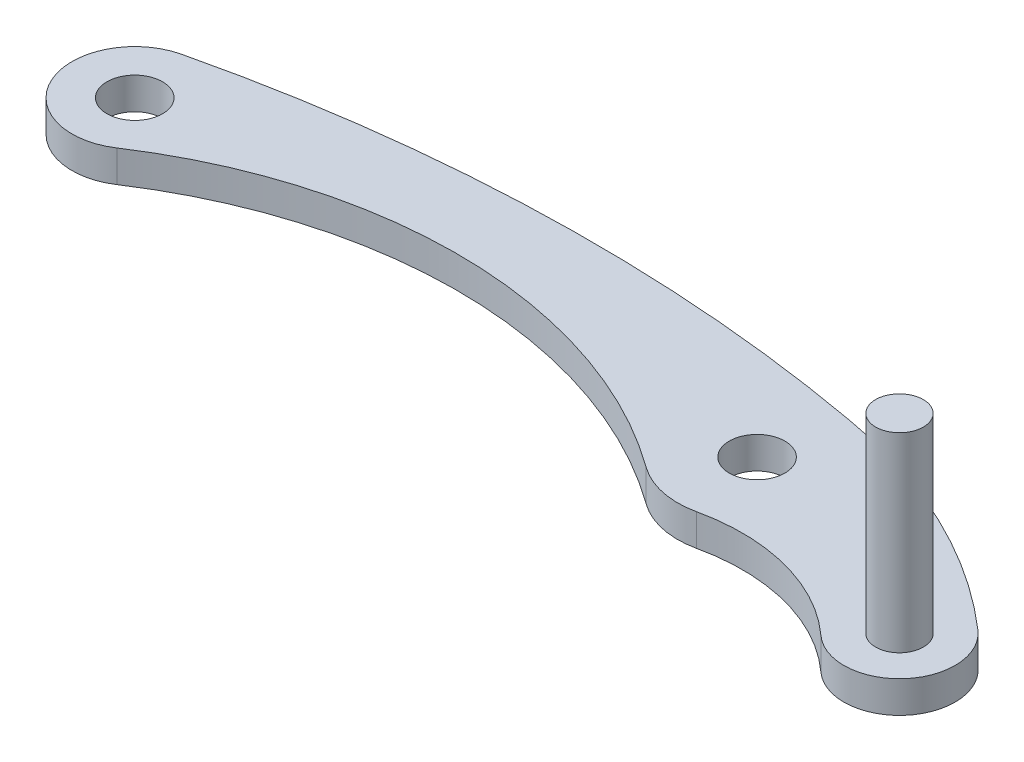
ISO-10303-21;
HEADER;
FILE_DESCRIPTION(('STEP AP214'),'2;1');
FILE_NAME('part.step','',(''),(''),'','','');
FILE_SCHEMA(('AUTOMOTIVE_DESIGN { 1 0 10303 214 1 1 1 1 }'));
ENDSEC;
DATA;
#1=APPLICATION_CONTEXT('core data for automotive mechanical design processes');
#2=APPLICATION_PROTOCOL_DEFINITION('international standard','automotive_design',2000,#1);
#3=PRODUCT_CONTEXT('',#1,'mechanical');
#4=PRODUCT('Part','Part','',(#3));
#5=PRODUCT_RELATED_PRODUCT_CATEGORY('part','',(#4));
#6=PRODUCT_DEFINITION_FORMATION('','',#4);
#7=PRODUCT_DEFINITION_CONTEXT('part definition',#1,'design');
#8=PRODUCT_DEFINITION('design','',#6,#7);
#9=PRODUCT_DEFINITION_SHAPE('','',#8);
#10=(LENGTH_UNIT() NAMED_UNIT(*) SI_UNIT(.MILLI.,.METRE.));
#11=(NAMED_UNIT(*) PLANE_ANGLE_UNIT() SI_UNIT($,.RADIAN.));
#12=(NAMED_UNIT(*) SI_UNIT($,.STERADIAN.) SOLID_ANGLE_UNIT());
#13=UNCERTAINTY_MEASURE_WITH_UNIT(LENGTH_MEASURE(1.E-05),#10,'distance_accuracy_value','');
#14=(GEOMETRIC_REPRESENTATION_CONTEXT(3) GLOBAL_UNCERTAINTY_ASSIGNED_CONTEXT((#13)) GLOBAL_UNIT_ASSIGNED_CONTEXT((#10,
#11,#12)) REPRESENTATION_CONTEXT('',''));
#15=CARTESIAN_POINT('',(0.,0.,0.));
#16=DIRECTION('',(0.,0.,1.));
#17=DIRECTION('',(1.,0.,0.));
#18=AXIS2_PLACEMENT_3D('',#15,#16,#17);
#19=CARTESIAN_POINT('',(39.178405,2.,0.));
#20=DIRECTION('',(0.,-1.,0.));
#21=DIRECTION('',(0.,0.,-1.));
#22=AXIS2_PLACEMENT_3D('',#19,#20,#21);
#23=CYLINDRICAL_SURFACE('',#22,5.);
#24=CARTESIAN_POINT('',(39.178405,0.,0.));
#25=DIRECTION('',(0.,1.,0.));
#26=DIRECTION('',(0.,0.,1.));
#27=AXIS2_PLACEMENT_3D('',#24,#25,#26);
#28=CIRCLE('',#27,5.);
#29=CARTESIAN_POINT('',(36.2479551434965,0.,4.05122989208442));
#30=VERTEX_POINT('',#29);
#31=CARTESIAN_POINT('',(40.257507506043,0.,4.8821652759254));
#32=VERTEX_POINT('',#31);
#33=EDGE_CURVE('E148',#30,#32,#28,.T.);
#34=ORIENTED_EDGE('',*,*,#33,.T.);
#35=DIRECTION('',(0.,-1.,0.));
#36=VECTOR('',#35,1.);
#37=CARTESIAN_POINT('',(40.257507506043,2.,4.8821652759254));
#38=LINE('',#37,#36);
#39=CARTESIAN_POINT('',(40.257507506043,2.,4.8821652759254));
#40=VERTEX_POINT('',#39);
#41=EDGE_CURVE('E11',#40,#32,#38,.T.);
#42=ORIENTED_EDGE('',*,*,#41,.F.);
#43=CARTESIAN_POINT('',(39.178405,2.,0.));
#44=DIRECTION('',(0.,1.,0.));
#45=DIRECTION('',(0.,0.,1.));
#46=AXIS2_PLACEMENT_3D('',#43,#44,#45);
#47=CIRCLE('',#46,5.);
#48=CARTESIAN_POINT('',(36.2479551434965,2.,4.05122989208442));
#49=VERTEX_POINT('',#48);
#50=EDGE_CURVE('E283',#49,#40,#47,.T.);
#51=ORIENTED_EDGE('',*,*,#50,.F.);
#52=DIRECTION('',(0.,-1.,0.));
#53=VECTOR('',#52,1.);
#54=CARTESIAN_POINT('',(36.2479551434965,2.,4.05122989208442));
#55=LINE('',#54,#53);
#56=EDGE_CURVE('E138',#49,#30,#55,.T.);
#57=ORIENTED_EDGE('',*,*,#56,.T.);
#58=EDGE_LOOP('',(#34,#42,#51,#57));
#59=FACE_BOUND('',#58,.T.);
#60=ADVANCED_FACE('F41',(#59),#23,.T.);
#61=CARTESIAN_POINT('',(42.8473535205461,2.,16.5993619381464));
#62=DIRECTION('',(0.,-1.,0.));
#63=DIRECTION('',(0.,0.,-1.));
#64=AXIS2_PLACEMENT_3D('',#61,#62,#63);
#65=CYLINDRICAL_SURFACE('',#64,12.);
#66=CARTESIAN_POINT('',(42.8473535205461,0.,16.5993619381464));
#67=DIRECTION('',(0.,1.,0.));
#68=DIRECTION('',(0.,0.,1.));
#69=AXIS2_PLACEMENT_3D('',#66,#67,#68);
#70=CIRCLE('',#69,12.);
#71=CARTESIAN_POINT('',(50.9194367137661,0.,7.72008984400857));
#72=VERTEX_POINT('',#71);
#73=EDGE_CURVE('E152',#32,#72,#70,.F.);
#74=ORIENTED_EDGE('',*,*,#73,.T.);
#75=DIRECTION('',(0.,-1.,0.));
#76=VECTOR('',#75,1.);
#77=CARTESIAN_POINT('',(50.9194367137661,2.,7.72008984400857));
#78=LINE('',#77,#76);
#79=CARTESIAN_POINT('',(50.9194367137661,2.,7.72008984400857));
#80=VERTEX_POINT('',#79);
#81=EDGE_CURVE('E51',#80,#72,#78,.T.);
#82=ORIENTED_EDGE('',*,*,#81,.F.);
#83=CARTESIAN_POINT('',(42.8473535205461,2.,16.5993619381464));
#84=DIRECTION('',(0.,1.,0.));
#85=DIRECTION('',(0.,0.,1.));
#86=AXIS2_PLACEMENT_3D('',#83,#84,#85);
#87=CIRCLE('',#86,12.);
#88=EDGE_CURVE('E98',#40,#80,#87,.F.);
#89=ORIENTED_EDGE('',*,*,#88,.F.);
#90=ORIENTED_EDGE('',*,*,#41,.T.);
#91=EDGE_LOOP('',(#74,#82,#89,#90));
#92=FACE_BOUND('',#91,.T.);
#93=ADVANCED_FACE('F198',(#92),#65,.F.);
#94=CARTESIAN_POINT('',(53.2737943117886,2.,5.13030214988504));
#95=DIRECTION('',(0.,-1.,0.));
#96=DIRECTION('',(0.,0.,-1.));
#97=AXIS2_PLACEMENT_3D('',#94,#95,#96);
#98=CYLINDRICAL_SURFACE('',#97,3.5);
#99=CARTESIAN_POINT('',(53.2737943117886,0.,5.13030214988504));
#100=DIRECTION('',(0.,1.,0.));
#101=DIRECTION('',(0.,0.,1.));
#102=AXIS2_PLACEMENT_3D('',#99,#100,#101);
#103=CIRCLE('',#102,3.5);
#104=CARTESIAN_POINT('',(55.5761043904865,0.,2.49413669575927));
#105=VERTEX_POINT('',#104);
#106=EDGE_CURVE('E155',#72,#105,#103,.T.);
#107=ORIENTED_EDGE('',*,*,#106,.T.);
#108=DIRECTION('',(0.,-1.,0.));
#109=VECTOR('',#108,1.);
#110=CARTESIAN_POINT('',(55.5761043904865,2.,2.49413669575927));
#111=LINE('',#110,#109);
#112=CARTESIAN_POINT('',(55.5761043904865,2.,2.49413669575927));
#113=VERTEX_POINT('',#112);
#114=EDGE_CURVE('E176',#113,#105,#111,.T.);
#115=ORIENTED_EDGE('',*,*,#114,.F.);
#116=CARTESIAN_POINT('',(53.2737943117886,2.,5.13030214988504));
#117=DIRECTION('',(0.,1.,0.));
#118=DIRECTION('',(0.,0.,1.));
#119=AXIS2_PLACEMENT_3D('',#116,#117,#118);
#120=CIRCLE('',#119,3.5);
#121=EDGE_CURVE('E132',#80,#113,#120,.T.);
#122=ORIENTED_EDGE('',*,*,#121,.F.);
#123=ORIENTED_EDGE('',*,*,#81,.T.);
#124=EDGE_LOOP('',(#107,#115,#122,#123));
#125=FACE_BOUND('',#124,.T.);
#126=ADVANCED_FACE('F183',(#125),#98,.T.);
#127=CARTESIAN_POINT('',(34.5264122423915,2.,26.5962208477663));
#128=DIRECTION('',(0.,-1.,0.));
#129=DIRECTION('',(0.,0.,-1.));
#130=AXIS2_PLACEMENT_3D('',#127,#128,#129);
#131=CYLINDRICAL_SURFACE('',#130,32.);
#132=CARTESIAN_POINT('',(34.5264122423915,0.,26.5962208477663));
#133=DIRECTION('',(0.,1.,0.));
#134=DIRECTION('',(0.,0.,1.));
#135=AXIS2_PLACEMENT_3D('',#132,#133,#134);
#136=CIRCLE('',#135,32.);
#137=CARTESIAN_POINT('',(40.0578049302101,0.,-4.92208645026521));
#138=VERTEX_POINT('',#137);
#139=EDGE_CURVE('E159',#138,#105,#136,.F.);
#140=ORIENTED_EDGE('',*,*,#139,.F.);
#141=DIRECTION('',(0.,-1.,0.));
#142=VECTOR('',#141,1.);
#143=CARTESIAN_POINT('',(40.0578049302101,2.,-4.92208645026521));
#144=LINE('',#143,#142);
#145=CARTESIAN_POINT('',(40.0578049302101,2.,-4.92208645026521));
#146=VERTEX_POINT('',#145);
#147=EDGE_CURVE('E118',#146,#138,#144,.T.);
#148=ORIENTED_EDGE('',*,*,#147,.F.);
#149=CARTESIAN_POINT('',(34.5264122423915,2.,26.5962208477663));
#150=DIRECTION('',(0.,1.,0.));
#151=DIRECTION('',(0.,0.,1.));
#152=AXIS2_PLACEMENT_3D('',#149,#150,#151);
#153=CIRCLE('',#152,32.);
#154=EDGE_CURVE('E128',#146,#113,#153,.F.);
#155=ORIENTED_EDGE('',*,*,#154,.T.);
#156=ORIENTED_EDGE('',*,*,#114,.T.);
#157=EDGE_LOOP('',(#140,#148,#155,#156));
#158=FACE_BOUND('',#157,.T.);
#159=ADVANCED_FACE('F190',(#158),#131,.T.);
#160=CARTESIAN_POINT('',(22.1493182065991,2.,93.4612764891579));
#161=DIRECTION('',(0.,-1.,0.));
#162=DIRECTION('',(0.,0.,-1.));
#163=AXIS2_PLACEMENT_3D('',#160,#161,#162);
#164=CYLINDRICAL_SURFACE('',#163,100.);
#165=CARTESIAN_POINT('',(22.1493182065991,0.,93.4612764891579));
#166=DIRECTION('',(0.,1.,0.));
#167=DIRECTION('',(0.,0.,1.));
#168=AXIS2_PLACEMENT_3D('',#165,#166,#167);
#169=CIRCLE('',#168,100.);
#170=CARTESIAN_POINT('',(-0.910877739886168,0.,-3.8435402616572));
#171=VERTEX_POINT('',#170);
#172=EDGE_CURVE('E116',#171,#138,#169,.F.);
#173=ORIENTED_EDGE('',*,*,#172,.F.);
#174=DIRECTION('',(0.,-1.,0.));
#175=VECTOR('',#174,1.);
#176=CARTESIAN_POINT('',(-0.910877739886168,2.,-3.8435402616572));
#177=LINE('',#176,#175);
#178=CARTESIAN_POINT('',(-0.910877739886168,2.,-3.8435402616572));
#179=VERTEX_POINT('',#178);
#180=EDGE_CURVE('E110',#179,#171,#177,.T.);
#181=ORIENTED_EDGE('',*,*,#180,.F.);
#182=CARTESIAN_POINT('',(22.1493182065991,2.,93.4612764891579));
#183=DIRECTION('',(0.,1.,0.));
#184=DIRECTION('',(0.,0.,1.));
#185=AXIS2_PLACEMENT_3D('',#182,#183,#184);
#186=CIRCLE('',#185,100.);
#187=EDGE_CURVE('E114',#179,#146,#186,.F.);
#188=ORIENTED_EDGE('',*,*,#187,.T.);
#189=ORIENTED_EDGE('',*,*,#147,.T.);
#190=EDGE_LOOP('',(#173,#181,#188,#189));
#191=FACE_BOUND('',#190,.T.);
#192=ADVANCED_FACE('F112',(#191),#164,.T.);
#193=CARTESIAN_POINT('',(0.,2.,0.));
#194=DIRECTION('',(0.,-1.,0.));
#195=DIRECTION('',(0.,0.,-1.));
#196=AXIS2_PLACEMENT_3D('',#193,#194,#195);
#197=CYLINDRICAL_SURFACE('',#196,3.95);
#198=CARTESIAN_POINT('',(0.,0.,0.));
#199=DIRECTION('',(0.,1.,0.));
#200=DIRECTION('',(0.,0.,1.));
#201=AXIS2_PLACEMENT_3D('',#198,#199,#200);
#202=CIRCLE('',#201,3.95);
#203=CARTESIAN_POINT('',(2.17165717872392,0.,3.29945527293474));
#204=VERTEX_POINT('',#203);
#205=EDGE_CURVE('E84',#171,#204,#202,.T.);
#206=ORIENTED_EDGE('',*,*,#205,.T.);
#207=DIRECTION('',(0.,-1.,0.));
#208=VECTOR('',#207,1.);
#209=CARTESIAN_POINT('',(2.17165717872392,2.,3.29945527293474));
#210=LINE('',#209,#208);
#211=CARTESIAN_POINT('',(2.17165717872392,2.,3.29945527293474));
#212=VERTEX_POINT('',#211);
#213=EDGE_CURVE('E119',#212,#204,#210,.T.);
#214=ORIENTED_EDGE('',*,*,#213,.F.);
#215=CARTESIAN_POINT('',(0.,2.,0.));
#216=DIRECTION('',(0.,1.,0.));
#217=DIRECTION('',(0.,0.,1.));
#218=AXIS2_PLACEMENT_3D('',#215,#216,#217);
#219=CIRCLE('',#218,3.95);
#220=EDGE_CURVE('E121',#179,#212,#219,.T.);
#221=ORIENTED_EDGE('',*,*,#220,.F.);
#222=ORIENTED_EDGE('',*,*,#180,.T.);
#223=EDGE_LOOP('',(#206,#214,#221,#222));
#224=FACE_BOUND('',#223,.T.);
#225=ADVANCED_FACE('F122',(#224),#197,.T.);
#226=CARTESIAN_POINT('',(39.178405,2.,0.));
#227=DIRECTION('',(0.,-1.,0.));
#228=DIRECTION('',(0.,0.,-1.));
#229=AXIS2_PLACEMENT_3D('',#226,#227,#228);
#230=CYLINDRICAL_SURFACE('',#229,1.75);
#231=CARTESIAN_POINT('',(39.178405,2.,0.));
#232=DIRECTION('',(0.,1.,0.));
#233=DIRECTION('',(0.,0.,1.));
#234=AXIS2_PLACEMENT_3D('',#231,#232,#233);
#235=CIRCLE('',#234,1.75);
#236=CARTESIAN_POINT('',(39.178405,2.,1.75));
#237=VERTEX_POINT('',#236);
#238=EDGE_CURVE('E220',#237,#237,#235,.T.);
#239=ORIENTED_EDGE('',*,*,#238,.T.);
#240=EDGE_LOOP('',(#239));
#241=FACE_BOUND('',#240,.T.);
#242=CARTESIAN_POINT('',(39.178405,0.,0.));
#243=DIRECTION('',(0.,1.,0.));
#244=DIRECTION('',(0.,0.,1.));
#245=AXIS2_PLACEMENT_3D('',#242,#243,#244);
#246=CIRCLE('',#245,1.75);
#247=CARTESIAN_POINT('',(39.178405,0.,1.75));
#248=VERTEX_POINT('',#247);
#249=EDGE_CURVE('E143',#248,#248,#246,.T.);
#250=ORIENTED_EDGE('',*,*,#249,.F.);
#251=EDGE_LOOP('',(#250));
#252=FACE_BOUND('',#251,.T.);
#253=ADVANCED_FACE('F207',(#241,#252),#230,.F.);
#254=CARTESIAN_POINT('',(0.,2.,0.));
#255=DIRECTION('',(0.,-1.,0.));
#256=DIRECTION('',(0.,0.,-1.));
#257=AXIS2_PLACEMENT_3D('',#254,#255,#256);
#258=CYLINDRICAL_SURFACE('',#257,1.75);
#259=CARTESIAN_POINT('',(0.,2.,0.));
#260=DIRECTION('',(0.,1.,0.));
#261=DIRECTION('',(0.,0.,1.));
#262=AXIS2_PLACEMENT_3D('',#259,#260,#261);
#263=CIRCLE('',#262,1.75);
#264=CARTESIAN_POINT('',(0.,2.,1.75));
#265=VERTEX_POINT('',#264);
#266=EDGE_CURVE('E169',#265,#265,#263,.T.);
#267=ORIENTED_EDGE('',*,*,#266,.T.);
#268=EDGE_LOOP('',(#267));
#269=FACE_BOUND('',#268,.T.);
#270=CARTESIAN_POINT('',(0.,0.,0.));
#271=DIRECTION('',(0.,1.,0.));
#272=DIRECTION('',(0.,0.,1.));
#273=AXIS2_PLACEMENT_3D('',#270,#271,#272);
#274=CIRCLE('',#273,1.75);
#275=CARTESIAN_POINT('',(0.,0.,1.75));
#276=VERTEX_POINT('',#275);
#277=EDGE_CURVE('E139',#276,#276,#274,.T.);
#278=ORIENTED_EDGE('',*,*,#277,.F.);
#279=EDGE_LOOP('',(#278));
#280=FACE_BOUND('',#279,.T.);
#281=ADVANCED_FACE('F43',(#269,#280),#258,.F.);
#282=CARTESIAN_POINT('',(18.6652560044752,2.,28.358609244591));
#283=DIRECTION('',(0.,-1.,0.));
#284=DIRECTION('',(0.,0.,-1.));
#285=AXIS2_PLACEMENT_3D('',#282,#283,#284);
#286=CYLINDRICAL_SURFACE('',#285,30.);
#287=CARTESIAN_POINT('',(18.6652560044752,0.,28.358609244591));
#288=DIRECTION('',(0.,1.,0.));
#289=DIRECTION('',(0.,0.,1.));
#290=AXIS2_PLACEMENT_3D('',#287,#288,#289);
#291=CIRCLE('',#290,30.);
#292=EDGE_CURVE('E90',#204,#30,#291,.F.);
#293=ORIENTED_EDGE('',*,*,#292,.T.);
#294=ORIENTED_EDGE('',*,*,#56,.F.);
#295=CARTESIAN_POINT('',(18.6652560044752,2.,28.358609244591));
#296=DIRECTION('',(0.,1.,0.));
#297=DIRECTION('',(0.,0.,1.));
#298=AXIS2_PLACEMENT_3D('',#295,#296,#297);
#299=CIRCLE('',#298,30.);
#300=EDGE_CURVE('E59',#212,#49,#299,.F.);
#301=ORIENTED_EDGE('',*,*,#300,.F.);
#302=ORIENTED_EDGE('',*,*,#213,.T.);
#303=EDGE_LOOP('',(#293,#294,#301,#302));
#304=FACE_BOUND('',#303,.T.);
#305=ADVANCED_FACE('F214',(#304),#286,.F.);
#306=CARTESIAN_POINT('',(0.,2.,0.));
#307=DIRECTION('',(0.,1.,0.));
#308=DIRECTION('',(0.,0.,1.));
#309=AXIS2_PLACEMENT_3D('',#306,#307,#308);
#310=PLANE('',#309);
#311=CARTESIAN_POINT('',(53.2737943117886,2.,5.13030214988504));
#312=DIRECTION('',(0.,1.,0.));
#313=DIRECTION('',(0.,0.,1.));
#314=AXIS2_PLACEMENT_3D('',#311,#312,#313);
#315=CIRCLE('',#314,1.5);
#316=CARTESIAN_POINT('',(53.2737943117886,2.,6.63030214988504));
#317=VERTEX_POINT('',#316);
#318=EDGE_CURVE('E272',#317,#317,#315,.T.);
#319=ORIENTED_EDGE('',*,*,#318,.F.);
#320=EDGE_LOOP('',(#319));
#321=FACE_BOUND('',#320,.T.);
#322=ORIENTED_EDGE('',*,*,#266,.F.);
#323=EDGE_LOOP('',(#322));
#324=FACE_BOUND('',#323,.T.);
#325=ORIENTED_EDGE('',*,*,#238,.F.);
#326=EDGE_LOOP('',(#325));
#327=FACE_BOUND('',#326,.T.);
#328=ORIENTED_EDGE('',*,*,#50,.T.);
#329=ORIENTED_EDGE('',*,*,#88,.T.);
#330=ORIENTED_EDGE('',*,*,#121,.T.);
#331=ORIENTED_EDGE('',*,*,#154,.F.);
#332=ORIENTED_EDGE('',*,*,#187,.F.);
#333=ORIENTED_EDGE('',*,*,#220,.T.);
#334=ORIENTED_EDGE('',*,*,#300,.T.);
#335=EDGE_LOOP('',(#328,#329,#330,#331,#332,#333,#334));
#336=FACE_BOUND('',#335,.T.);
#337=ADVANCED_FACE('F126',(#321,#324,#327,#336),#310,.T.);
#338=CARTESIAN_POINT('',(0.,0.,0.));
#339=DIRECTION('',(0.,1.,0.));
#340=DIRECTION('',(0.,0.,1.));
#341=AXIS2_PLACEMENT_3D('',#338,#339,#340);
#342=PLANE('',#341);
#343=ORIENTED_EDGE('',*,*,#277,.T.);
#344=EDGE_LOOP('',(#343));
#345=FACE_BOUND('',#344,.T.);
#346=ORIENTED_EDGE('',*,*,#249,.T.);
#347=EDGE_LOOP('',(#346));
#348=FACE_BOUND('',#347,.T.);
#349=ORIENTED_EDGE('',*,*,#33,.F.);
#350=ORIENTED_EDGE('',*,*,#292,.F.);
#351=ORIENTED_EDGE('',*,*,#205,.F.);
#352=ORIENTED_EDGE('',*,*,#172,.T.);
#353=ORIENTED_EDGE('',*,*,#139,.T.);
#354=ORIENTED_EDGE('',*,*,#106,.F.);
#355=ORIENTED_EDGE('',*,*,#73,.F.);
#356=EDGE_LOOP('',(#349,#350,#351,#352,#353,#354,#355));
#357=FACE_BOUND('',#356,.T.);
#358=ADVANCED_FACE('F187',(#345,#348,#357),#342,.F.);
#359=CARTESIAN_POINT('',(53.2737943117886,14.,5.13030214988504));
#360=DIRECTION('',(0.,-1.,0.));
#361=DIRECTION('',(0.,0.,-1.));
#362=AXIS2_PLACEMENT_3D('',#359,#360,#361);
#363=CYLINDRICAL_SURFACE('',#362,1.5);
#364=CARTESIAN_POINT('',(53.2737943117886,14.,5.13030214988504));
#365=DIRECTION('',(0.,1.,0.));
#366=DIRECTION('',(0.,0.,1.));
#367=AXIS2_PLACEMENT_3D('',#364,#365,#366);
#368=CIRCLE('',#367,1.5);
#369=CARTESIAN_POINT('',(53.2737943117886,14.,6.63030214988504));
#370=VERTEX_POINT('',#369);
#371=EDGE_CURVE('E144',#370,#370,#368,.T.);
#372=ORIENTED_EDGE('',*,*,#371,.F.);
#373=EDGE_LOOP('',(#372));
#374=FACE_BOUND('',#373,.T.);
#375=ORIENTED_EDGE('',*,*,#318,.T.);
#376=EDGE_LOOP('',(#375));
#377=FACE_BOUND('',#376,.T.);
#378=ADVANCED_FACE('F224',(#374,#377),#363,.T.);
#379=CARTESIAN_POINT('',(53.2737943117886,14.,5.13030214988504));
#380=DIRECTION('',(0.,1.,0.));
#381=DIRECTION('',(0.,0.,1.));
#382=AXIS2_PLACEMENT_3D('',#379,#380,#381);
#383=PLANE('',#382);
#384=ORIENTED_EDGE('',*,*,#371,.T.);
#385=EDGE_LOOP('',(#384));
#386=FACE_BOUND('',#385,.T.);
#387=ADVANCED_FACE('F231',(#386),#383,.T.);
#388=CLOSED_SHELL('',(#60,#93,#126,#159,#192,#225,#253,#281,#305,#337,#358,#378,#387));
#389=MANIFOLD_SOLID_BREP('B2',#388);
#390=ADVANCED_BREP_SHAPE_REPRESENTATION('',(#18,#389),#14);
#391=SHAPE_DEFINITION_REPRESENTATION(#9,#390);
ENDSEC;
END-ISO-10303-21;
